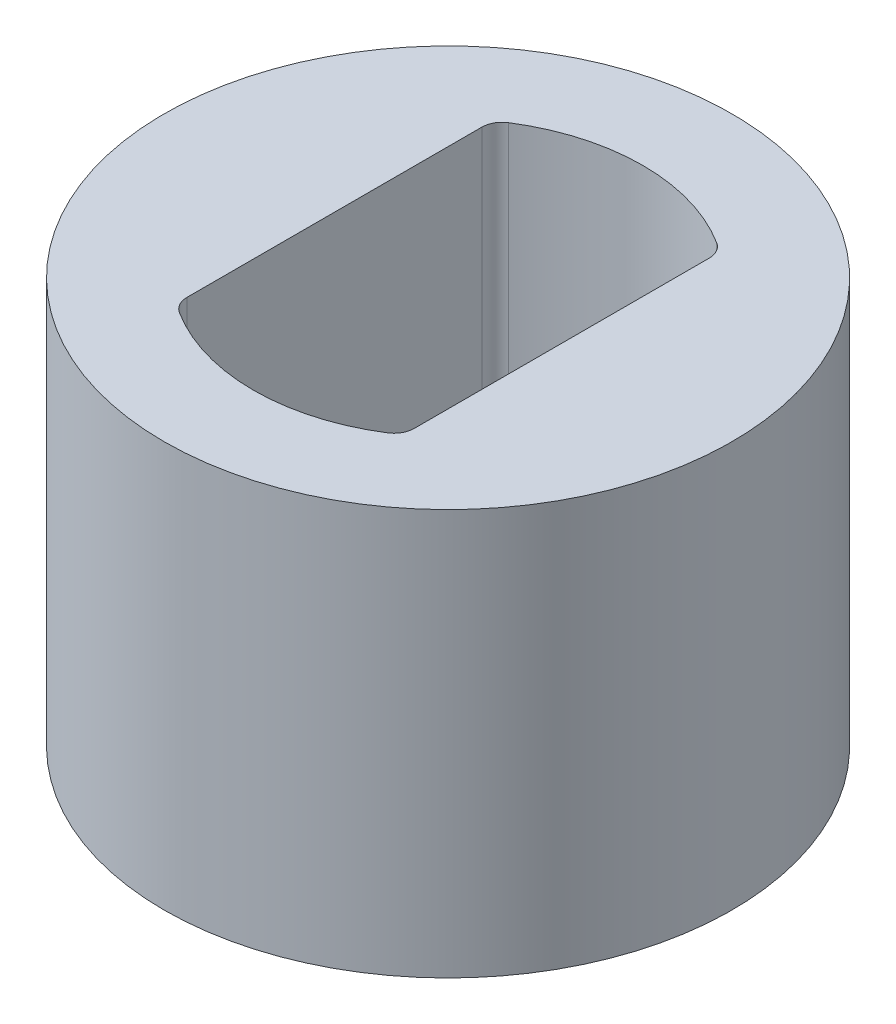
ISO-10303-21;
HEADER;
FILE_DESCRIPTION(('STEP AP214'),'2;1');
FILE_NAME('part.step','',(''),(''),'','','');
FILE_SCHEMA(('AUTOMOTIVE_DESIGN { 1 0 10303 214 1 1 1 1 }'));
ENDSEC;
DATA;
#1=APPLICATION_CONTEXT('core data for automotive mechanical design processes');
#2=APPLICATION_PROTOCOL_DEFINITION('international standard','automotive_design',2000,#1);
#3=PRODUCT_CONTEXT('',#1,'mechanical');
#4=PRODUCT('Part','Part','',(#3));
#5=PRODUCT_RELATED_PRODUCT_CATEGORY('part','',(#4));
#6=PRODUCT_DEFINITION_FORMATION('','',#4);
#7=PRODUCT_DEFINITION_CONTEXT('part definition',#1,'design');
#8=PRODUCT_DEFINITION('design','',#6,#7);
#9=PRODUCT_DEFINITION_SHAPE('','',#8);
#10=(LENGTH_UNIT() NAMED_UNIT(*) SI_UNIT(.MILLI.,.METRE.));
#11=(NAMED_UNIT(*) PLANE_ANGLE_UNIT() SI_UNIT($,.RADIAN.));
#12=(NAMED_UNIT(*) SI_UNIT($,.STERADIAN.) SOLID_ANGLE_UNIT());
#13=UNCERTAINTY_MEASURE_WITH_UNIT(LENGTH_MEASURE(1.E-05),#10,'distance_accuracy_value','');
#14=(GEOMETRIC_REPRESENTATION_CONTEXT(3) GLOBAL_UNCERTAINTY_ASSIGNED_CONTEXT((#13)) GLOBAL_UNIT_ASSIGNED_CONTEXT((#10,
#11,#12)) REPRESENTATION_CONTEXT('',''));
#15=CARTESIAN_POINT('',(0.,0.,0.));
#16=DIRECTION('',(0.,0.,1.));
#17=DIRECTION('',(1.,0.,0.));
#18=AXIS2_PLACEMENT_3D('',#15,#16,#17);
#19=CARTESIAN_POINT('',(0.,5.,0.));
#20=DIRECTION('',(0.,1.,0.));
#21=DIRECTION('',(0.,0.,1.));
#22=AXIS2_PLACEMENT_3D('',#19,#20,#21);
#23=PLANE('',#22);
#24=CARTESIAN_POINT('',(0.,5.,0.));
#25=DIRECTION('',(0.,1.,0.));
#26=DIRECTION('',(0.,0.,1.));
#27=AXIS2_PLACEMENT_3D('',#24,#25,#26);
#28=CIRCLE('',#27,3.5);
#29=CARTESIAN_POINT('',(0.,5.,3.5));
#30=VERTEX_POINT('',#29);
#31=EDGE_CURVE('E117',#30,#30,#28,.T.);
#32=ORIENTED_EDGE('',*,*,#31,.T.);
#33=EDGE_LOOP('',(#32));
#34=FACE_BOUND('',#33,.T.);
#35=CARTESIAN_POINT('',(0.,5.,0.));
#36=DIRECTION('',(0.,1.,0.));
#37=DIRECTION('',(0.,0.,1.));
#38=AXIS2_PLACEMENT_3D('',#35,#36,#37);
#39=CIRCLE('',#38,2.4);
#40=CARTESIAN_POINT('',(1.28372093023256,5.,-2.02782163251181));
#41=VERTEX_POINT('',#40);
#42=CARTESIAN_POINT('',(-1.28372093023256,5.,-2.02782163251181));
#43=VERTEX_POINT('',#42);
#44=EDGE_CURVE('E101',#41,#43,#39,.T.);
#45=ORIENTED_EDGE('',*,*,#44,.F.);
#46=CARTESIAN_POINT('',(1.15,5.,-1.8165902124585));
#47=DIRECTION('',(0.,1.,0.));
#48=DIRECTION('',(0.,0.,1.));
#49=AXIS2_PLACEMENT_3D('',#46,#47,#48);
#50=CIRCLE('',#49,0.25);
#51=CARTESIAN_POINT('',(1.4,5.,-1.8165902124585));
#52=VERTEX_POINT('',#51);
#53=EDGE_CURVE('E98',#41,#52,#50,.F.);
#54=ORIENTED_EDGE('',*,*,#53,.T.);
#55=DIRECTION('',(0.,0.,1.));
#56=VECTOR('',#55,1.);
#57=CARTESIAN_POINT('',(1.4,5.,0.));
#58=LINE('',#57,#56);
#59=CARTESIAN_POINT('',(1.4,5.,1.8165902124585));
#60=VERTEX_POINT('',#59);
#61=EDGE_CURVE('E100',#52,#60,#58,.T.);
#62=ORIENTED_EDGE('',*,*,#61,.T.);
#63=CARTESIAN_POINT('',(1.15,5.,1.8165902124585));
#64=DIRECTION('',(0.,1.,0.));
#65=DIRECTION('',(0.,0.,1.));
#66=AXIS2_PLACEMENT_3D('',#63,#64,#65);
#67=CIRCLE('',#66,0.25);
#68=CARTESIAN_POINT('',(1.28372093023256,5.,2.02782163251181));
#69=VERTEX_POINT('',#68);
#70=EDGE_CURVE('E138',#60,#69,#67,.F.);
#71=ORIENTED_EDGE('',*,*,#70,.T.);
#72=CARTESIAN_POINT('',(-1.28372093023256,5.,2.02782163251181));
#73=VERTEX_POINT('',#72);
#74=EDGE_CURVE('E152',#73,#69,#39,.T.);
#75=ORIENTED_EDGE('',*,*,#74,.F.);
#76=CARTESIAN_POINT('',(-1.15,5.,1.8165902124585));
#77=DIRECTION('',(0.,1.,0.));
#78=DIRECTION('',(0.,0.,1.));
#79=AXIS2_PLACEMENT_3D('',#76,#77,#78);
#80=CIRCLE('',#79,0.25);
#81=CARTESIAN_POINT('',(-1.4,5.,1.8165902124585));
#82=VERTEX_POINT('',#81);
#83=EDGE_CURVE('E142',#73,#82,#80,.F.);
#84=ORIENTED_EDGE('',*,*,#83,.T.);
#85=DIRECTION('',(0.,0.,1.));
#86=VECTOR('',#85,1.);
#87=CARTESIAN_POINT('',(-1.4,5.,0.));
#88=LINE('',#87,#86);
#89=CARTESIAN_POINT('',(-1.4,5.,-1.8165902124585));
#90=VERTEX_POINT('',#89);
#91=EDGE_CURVE('E147',#90,#82,#88,.T.);
#92=ORIENTED_EDGE('',*,*,#91,.F.);
#93=CARTESIAN_POINT('',(-1.15,5.,-1.8165902124585));
#94=DIRECTION('',(0.,1.,0.));
#95=DIRECTION('',(0.,0.,1.));
#96=AXIS2_PLACEMENT_3D('',#93,#94,#95);
#97=CIRCLE('',#96,0.25);
#98=EDGE_CURVE('E40',#90,#43,#97,.F.);
#99=ORIENTED_EDGE('',*,*,#98,.T.);
#100=EDGE_LOOP('',(#45,#54,#62,#71,#75,#84,#92,#99));
#101=FACE_BOUND('',#100,.T.);
#102=ADVANCED_FACE('F32',(#34,#101),#23,.T.);
#103=CARTESIAN_POINT('',(0.,0.,0.));
#104=DIRECTION('',(0.,1.,0.));
#105=DIRECTION('',(0.,0.,1.));
#106=AXIS2_PLACEMENT_3D('',#103,#104,#105);
#107=PLANE('',#106);
#108=CARTESIAN_POINT('',(0.,0.,0.));
#109=DIRECTION('',(0.,1.,0.));
#110=DIRECTION('',(0.,0.,1.));
#111=AXIS2_PLACEMENT_3D('',#108,#109,#110);
#112=CIRCLE('',#111,3.5);
#113=CARTESIAN_POINT('',(0.,0.,3.5));
#114=VERTEX_POINT('',#113);
#115=EDGE_CURVE('E122',#114,#114,#112,.T.);
#116=ORIENTED_EDGE('',*,*,#115,.F.);
#117=EDGE_LOOP('',(#116));
#118=FACE_BOUND('',#117,.T.);
#119=DIRECTION('',(0.,0.,1.));
#120=VECTOR('',#119,1.);
#121=CARTESIAN_POINT('',(1.4,0.,0.));
#122=LINE('',#121,#120);
#123=CARTESIAN_POINT('',(1.4,0.,-1.8165902124585));
#124=VERTEX_POINT('',#123);
#125=CARTESIAN_POINT('',(1.4,0.,1.8165902124585));
#126=VERTEX_POINT('',#125);
#127=EDGE_CURVE('E167',#124,#126,#122,.T.);
#128=ORIENTED_EDGE('',*,*,#127,.F.);
#129=CARTESIAN_POINT('',(1.15,0.,-1.8165902124585));
#130=DIRECTION('',(0.,1.,0.));
#131=DIRECTION('',(0.,0.,1.));
#132=AXIS2_PLACEMENT_3D('',#129,#130,#131);
#133=CIRCLE('',#132,0.25);
#134=CARTESIAN_POINT('',(1.28372093023256,0.,-2.02782163251181));
#135=VERTEX_POINT('',#134);
#136=EDGE_CURVE('E54',#124,#135,#133,.T.);
#137=ORIENTED_EDGE('',*,*,#136,.T.);
#138=CARTESIAN_POINT('',(0.,0.,0.));
#139=DIRECTION('',(0.,1.,0.));
#140=DIRECTION('',(0.,0.,1.));
#141=AXIS2_PLACEMENT_3D('',#138,#139,#140);
#142=CIRCLE('',#141,2.4);
#143=CARTESIAN_POINT('',(-1.28372093023256,0.,-2.02782163251181));
#144=VERTEX_POINT('',#143);
#145=EDGE_CURVE('E159',#135,#144,#142,.T.);
#146=ORIENTED_EDGE('',*,*,#145,.T.);
#147=CARTESIAN_POINT('',(-1.15,0.,-1.8165902124585));
#148=DIRECTION('',(0.,1.,0.));
#149=DIRECTION('',(0.,0.,1.));
#150=AXIS2_PLACEMENT_3D('',#147,#148,#149);
#151=CIRCLE('',#150,0.25);
#152=CARTESIAN_POINT('',(-1.4,0.,-1.8165902124585));
#153=VERTEX_POINT('',#152);
#154=EDGE_CURVE('E11',#144,#153,#151,.T.);
#155=ORIENTED_EDGE('',*,*,#154,.T.);
#156=DIRECTION('',(0.,0.,1.));
#157=VECTOR('',#156,1.);
#158=CARTESIAN_POINT('',(-1.4,0.,0.));
#159=LINE('',#158,#157);
#160=CARTESIAN_POINT('',(-1.4,0.,1.8165902124585));
#161=VERTEX_POINT('',#160);
#162=EDGE_CURVE('E157',#153,#161,#159,.T.);
#163=ORIENTED_EDGE('',*,*,#162,.T.);
#164=CARTESIAN_POINT('',(-1.15,0.,1.8165902124585));
#165=DIRECTION('',(0.,1.,0.));
#166=DIRECTION('',(0.,0.,1.));
#167=AXIS2_PLACEMENT_3D('',#164,#165,#166);
#168=CIRCLE('',#167,0.25);
#169=CARTESIAN_POINT('',(-1.28372093023256,0.,2.02782163251181));
#170=VERTEX_POINT('',#169);
#171=EDGE_CURVE('E106',#161,#170,#168,.T.);
#172=ORIENTED_EDGE('',*,*,#171,.T.);
#173=CARTESIAN_POINT('',(1.28372093023256,0.,2.02782163251181));
#174=VERTEX_POINT('',#173);
#175=EDGE_CURVE('E163',#170,#174,#142,.T.);
#176=ORIENTED_EDGE('',*,*,#175,.T.);
#177=CARTESIAN_POINT('',(1.15,0.,1.8165902124585));
#178=DIRECTION('',(0.,1.,0.));
#179=DIRECTION('',(0.,0.,1.));
#180=AXIS2_PLACEMENT_3D('',#177,#178,#179);
#181=CIRCLE('',#180,0.25);
#182=EDGE_CURVE('E140',#174,#126,#181,.T.);
#183=ORIENTED_EDGE('',*,*,#182,.T.);
#184=EDGE_LOOP('',(#128,#137,#146,#155,#163,#172,#176,#183));
#185=FACE_BOUND('',#184,.T.);
#186=ADVANCED_FACE('F156',(#118,#185),#107,.F.);
#187=CARTESIAN_POINT('',(0.,5.,0.));
#188=DIRECTION('',(0.,-1.,0.));
#189=DIRECTION('',(0.,0.,-1.));
#190=AXIS2_PLACEMENT_3D('',#187,#188,#189);
#191=CYLINDRICAL_SURFACE('',#190,3.5);
#192=ORIENTED_EDGE('',*,*,#31,.F.);
#193=EDGE_LOOP('',(#192));
#194=FACE_BOUND('',#193,.T.);
#195=ORIENTED_EDGE('',*,*,#115,.T.);
#196=EDGE_LOOP('',(#195));
#197=FACE_BOUND('',#196,.T.);
#198=ADVANCED_FACE('F189',(#194,#197),#191,.T.);
#199=CARTESIAN_POINT('',(1.4,0.,0.));
#200=DIRECTION('',(-1.,0.,0.));
#201=DIRECTION('',(0.,0.,1.));
#202=AXIS2_PLACEMENT_3D('',#199,#200,#201);
#203=PLANE('',#202);
#204=ORIENTED_EDGE('',*,*,#127,.T.);
#205=DIRECTION('',(0.,1.,0.));
#206=VECTOR('',#205,1.);
#207=CARTESIAN_POINT('',(1.4,0.,1.8165902124585));
#208=LINE('',#207,#206);
#209=EDGE_CURVE('E114',#126,#60,#208,.T.);
#210=ORIENTED_EDGE('',*,*,#209,.T.);
#211=ORIENTED_EDGE('',*,*,#61,.F.);
#212=DIRECTION('',(0.,1.,0.));
#213=VECTOR('',#212,1.);
#214=CARTESIAN_POINT('',(1.4,0.,-1.8165902124585));
#215=LINE('',#214,#213);
#216=EDGE_CURVE('E112',#52,#124,#215,.F.);
#217=ORIENTED_EDGE('',*,*,#216,.T.);
#218=EDGE_LOOP('',(#204,#210,#211,#217));
#219=FACE_BOUND('',#218,.T.);
#220=ADVANCED_FACE('F111',(#219),#203,.T.);
#221=CARTESIAN_POINT('',(0.,0.,0.));
#222=DIRECTION('',(0.,1.,0.));
#223=DIRECTION('',(0.,0.,1.));
#224=AXIS2_PLACEMENT_3D('',#221,#222,#223);
#225=CYLINDRICAL_SURFACE('',#224,2.4);
#226=ORIENTED_EDGE('',*,*,#74,.T.);
#227=DIRECTION('',(0.,1.,0.));
#228=VECTOR('',#227,1.);
#229=CARTESIAN_POINT('',(1.28372093023256,0.,2.02782163251181));
#230=LINE('',#229,#228);
#231=EDGE_CURVE('E128',#69,#174,#230,.F.);
#232=ORIENTED_EDGE('',*,*,#231,.T.);
#233=ORIENTED_EDGE('',*,*,#175,.F.);
#234=DIRECTION('',(0.,1.,0.));
#235=VECTOR('',#234,1.);
#236=CARTESIAN_POINT('',(-1.28372093023256,0.,2.02782163251181));
#237=LINE('',#236,#235);
#238=EDGE_CURVE('E119',#170,#73,#237,.T.);
#239=ORIENTED_EDGE('',*,*,#238,.T.);
#240=EDGE_LOOP('',(#226,#232,#233,#239));
#241=FACE_BOUND('',#240,.T.);
#242=ADVANCED_FACE('F181',(#241),#225,.F.);
#243=CARTESIAN_POINT('',(-1.4,0.,0.));
#244=DIRECTION('',(-1.,0.,0.));
#245=DIRECTION('',(0.,0.,1.));
#246=AXIS2_PLACEMENT_3D('',#243,#244,#245);
#247=PLANE('',#246);
#248=ORIENTED_EDGE('',*,*,#91,.T.);
#249=DIRECTION('',(0.,-1.,0.));
#250=VECTOR('',#249,1.);
#251=CARTESIAN_POINT('',(-1.4,0.,1.8165902124585));
#252=LINE('',#251,#250);
#253=EDGE_CURVE('E133',#82,#161,#252,.T.);
#254=ORIENTED_EDGE('',*,*,#253,.T.);
#255=ORIENTED_EDGE('',*,*,#162,.F.);
#256=DIRECTION('',(0.,-1.,0.));
#257=VECTOR('',#256,1.);
#258=CARTESIAN_POINT('',(-1.4,5.,-1.8165902124585));
#259=LINE('',#258,#257);
#260=EDGE_CURVE('E130',#153,#90,#259,.F.);
#261=ORIENTED_EDGE('',*,*,#260,.T.);
#262=EDGE_LOOP('',(#248,#254,#255,#261));
#263=FACE_BOUND('',#262,.T.);
#264=ADVANCED_FACE('F161',(#263),#247,.F.);
#265=ORIENTED_EDGE('',*,*,#145,.F.);
#266=DIRECTION('',(0.,1.,0.));
#267=VECTOR('',#266,1.);
#268=CARTESIAN_POINT('',(1.28372093023256,0.,-2.02782163251181));
#269=LINE('',#268,#267);
#270=EDGE_CURVE('E136',#135,#41,#269,.T.);
#271=ORIENTED_EDGE('',*,*,#270,.T.);
#272=ORIENTED_EDGE('',*,*,#44,.T.);
#273=DIRECTION('',(0.,1.,0.));
#274=VECTOR('',#273,1.);
#275=CARTESIAN_POINT('',(-1.28372093023256,0.,-2.02782163251181));
#276=LINE('',#275,#274);
#277=EDGE_CURVE('E47',#43,#144,#276,.F.);
#278=ORIENTED_EDGE('',*,*,#277,.T.);
#279=EDGE_LOOP('',(#265,#271,#272,#278));
#280=FACE_BOUND('',#279,.T.);
#281=ADVANCED_FACE('F150',(#280),#225,.F.);
#282=CARTESIAN_POINT('',(1.15,0.,1.8165902124585));
#283=DIRECTION('',(0.,1.,0.));
#284=DIRECTION('',(0.,0.,1.));
#285=AXIS2_PLACEMENT_3D('',#282,#283,#284);
#286=CYLINDRICAL_SURFACE('',#285,0.25);
#287=ORIENTED_EDGE('',*,*,#182,.F.);
#288=ORIENTED_EDGE('',*,*,#231,.F.);
#289=ORIENTED_EDGE('',*,*,#70,.F.);
#290=ORIENTED_EDGE('',*,*,#209,.F.);
#291=EDGE_LOOP('',(#287,#288,#289,#290));
#292=FACE_BOUND('',#291,.T.);
#293=ADVANCED_FACE('F176',(#292),#286,.F.);
#294=CARTESIAN_POINT('',(-1.15,0.,1.8165902124585));
#295=DIRECTION('',(0.,1.,0.));
#296=DIRECTION('',(0.,0.,1.));
#297=AXIS2_PLACEMENT_3D('',#294,#295,#296);
#298=CYLINDRICAL_SURFACE('',#297,0.25);
#299=ORIENTED_EDGE('',*,*,#171,.F.);
#300=ORIENTED_EDGE('',*,*,#253,.F.);
#301=ORIENTED_EDGE('',*,*,#83,.F.);
#302=ORIENTED_EDGE('',*,*,#238,.F.);
#303=EDGE_LOOP('',(#299,#300,#301,#302));
#304=FACE_BOUND('',#303,.T.);
#305=ADVANCED_FACE('F179',(#304),#298,.F.);
#306=CARTESIAN_POINT('',(1.15,0.,-1.8165902124585));
#307=DIRECTION('',(0.,1.,0.));
#308=DIRECTION('',(0.,0.,1.));
#309=AXIS2_PLACEMENT_3D('',#306,#307,#308);
#310=CYLINDRICAL_SURFACE('',#309,0.25);
#311=ORIENTED_EDGE('',*,*,#136,.F.);
#312=ORIENTED_EDGE('',*,*,#216,.F.);
#313=ORIENTED_EDGE('',*,*,#53,.F.);
#314=ORIENTED_EDGE('',*,*,#270,.F.);
#315=EDGE_LOOP('',(#311,#312,#313,#314));
#316=FACE_BOUND('',#315,.T.);
#317=ADVANCED_FACE('F116',(#316),#310,.F.);
#318=CARTESIAN_POINT('',(-1.15,0.,-1.8165902124585));
#319=DIRECTION('',(0.,1.,0.));
#320=DIRECTION('',(0.,0.,1.));
#321=AXIS2_PLACEMENT_3D('',#318,#319,#320);
#322=CYLINDRICAL_SURFACE('',#321,0.25);
#323=ORIENTED_EDGE('',*,*,#154,.F.);
#324=ORIENTED_EDGE('',*,*,#277,.F.);
#325=ORIENTED_EDGE('',*,*,#98,.F.);
#326=ORIENTED_EDGE('',*,*,#260,.F.);
#327=EDGE_LOOP('',(#323,#324,#325,#326));
#328=FACE_BOUND('',#327,.T.);
#329=ADVANCED_FACE('F34',(#328),#322,.F.);
#330=CLOSED_SHELL('',(#102,#186,#198,#220,#242,#264,#281,#293,#305,#317,#329));
#331=MANIFOLD_SOLID_BREP('B2',#330);
#332=ADVANCED_BREP_SHAPE_REPRESENTATION('',(#18,#331),#14);
#333=SHAPE_DEFINITION_REPRESENTATION(#9,#332);
ENDSEC;
END-ISO-10303-21;
